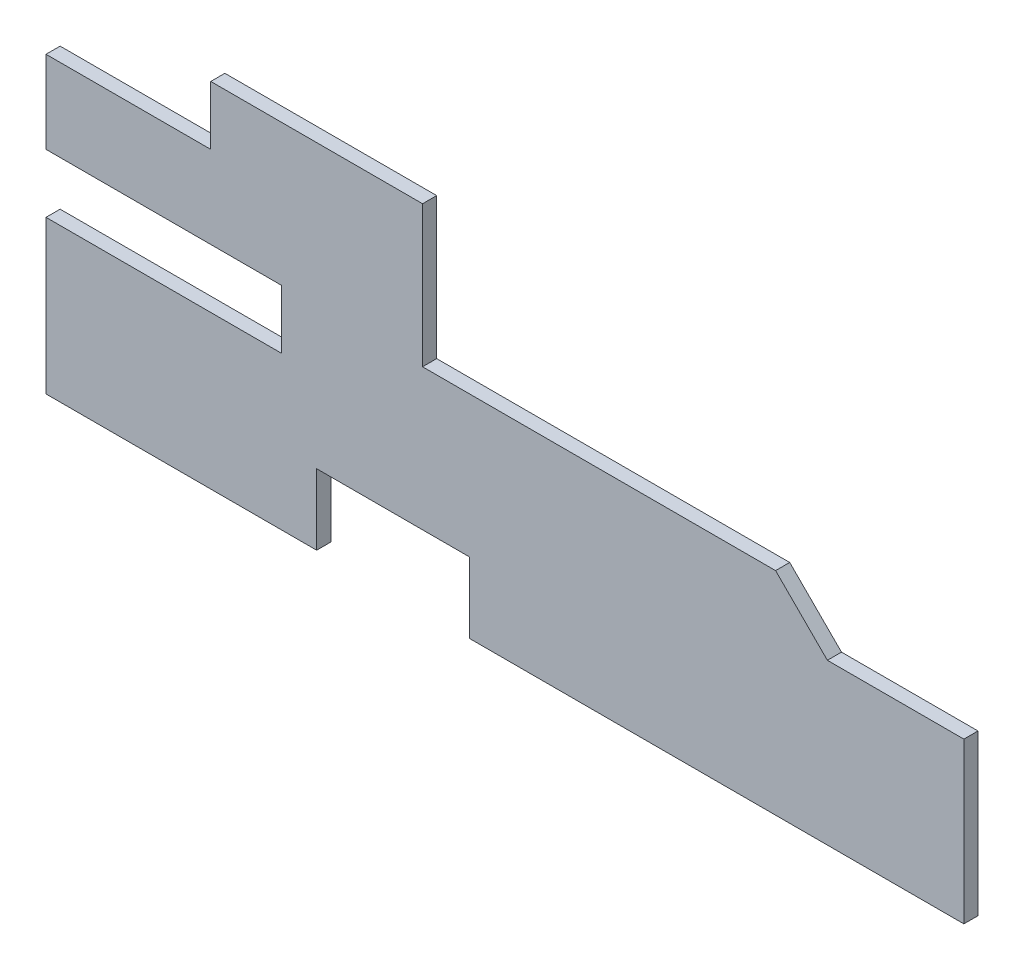
ISO-10303-21;
HEADER;
FILE_DESCRIPTION(('STEP AP214'),'2;1');
FILE_NAME('part.step','',(''),(''),'','','');
FILE_SCHEMA(('AUTOMOTIVE_DESIGN { 1 0 10303 214 1 1 1 1 }'));
ENDSEC;
DATA;
#1=APPLICATION_CONTEXT('core data for automotive mechanical design processes');
#2=APPLICATION_PROTOCOL_DEFINITION('international standard','automotive_design',2000,#1);
#3=PRODUCT_CONTEXT('',#1,'mechanical');
#4=PRODUCT('Part','Part','',(#3));
#5=PRODUCT_RELATED_PRODUCT_CATEGORY('part','',(#4));
#6=PRODUCT_DEFINITION_FORMATION('','',#4);
#7=PRODUCT_DEFINITION_CONTEXT('part definition',#1,'design');
#8=PRODUCT_DEFINITION('design','',#6,#7);
#9=PRODUCT_DEFINITION_SHAPE('','',#8);
#10=(LENGTH_UNIT() NAMED_UNIT(*) SI_UNIT(.MILLI.,.METRE.));
#11=(NAMED_UNIT(*) PLANE_ANGLE_UNIT() SI_UNIT($,.RADIAN.));
#12=(NAMED_UNIT(*) SI_UNIT($,.STERADIAN.) SOLID_ANGLE_UNIT());
#13=UNCERTAINTY_MEASURE_WITH_UNIT(LENGTH_MEASURE(1.E-05),#10,'distance_accuracy_value','');
#14=(GEOMETRIC_REPRESENTATION_CONTEXT(3) GLOBAL_UNCERTAINTY_ASSIGNED_CONTEXT((#13)) GLOBAL_UNIT_ASSIGNED_CONTEXT((#10,
#11,#12)) REPRESENTATION_CONTEXT('',''));
#15=CARTESIAN_POINT('',(0.,0.,0.));
#16=DIRECTION('',(0.,0.,1.));
#17=DIRECTION('',(1.,0.,0.));
#18=AXIS2_PLACEMENT_3D('',#15,#16,#17);
#19=CARTESIAN_POINT('',(0.,6.5,0.6));
#20=DIRECTION('',(1.,0.,0.));
#21=DIRECTION('',(0.,1.,0.));
#22=AXIS2_PLACEMENT_3D('',#19,#20,#21);
#23=PLANE('',#22);
#24=DIRECTION('',(0.,-1.,0.));
#25=VECTOR('',#24,1.);
#26=CARTESIAN_POINT('',(0.,6.5,0.));
#27=LINE('',#26,#25);
#28=CARTESIAN_POINT('',(0.,6.5,0.));
#29=VERTEX_POINT('',#28);
#30=CARTESIAN_POINT('',(0.,0.,0.));
#31=VERTEX_POINT('',#30);
#32=EDGE_CURVE('E190',#29,#31,#27,.T.);
#33=ORIENTED_EDGE('',*,*,#32,.T.);
#34=DIRECTION('',(0.,0.,-1.));
#35=VECTOR('',#34,1.);
#36=CARTESIAN_POINT('',(0.,0.,0.6));
#37=LINE('',#36,#35);
#38=CARTESIAN_POINT('',(0.,0.,0.6));
#39=VERTEX_POINT('',#38);
#40=EDGE_CURVE('E11',#39,#31,#37,.T.);
#41=ORIENTED_EDGE('',*,*,#40,.F.);
#42=DIRECTION('',(0.,-1.,0.));
#43=VECTOR('',#42,1.);
#44=CARTESIAN_POINT('',(0.,6.5,0.6));
#45=LINE('',#44,#43);
#46=CARTESIAN_POINT('',(0.,6.5,0.6));
#47=VERTEX_POINT('',#46);
#48=EDGE_CURVE('E224',#47,#39,#45,.T.);
#49=ORIENTED_EDGE('',*,*,#48,.F.);
#50=DIRECTION('',(0.,0.,-1.));
#51=VECTOR('',#50,1.);
#52=CARTESIAN_POINT('',(0.,6.5,0.6));
#53=LINE('',#52,#51);
#54=EDGE_CURVE('E186',#47,#29,#53,.T.);
#55=ORIENTED_EDGE('',*,*,#54,.T.);
#56=EDGE_LOOP('',(#33,#41,#49,#55));
#57=FACE_BOUND('',#56,.T.);
#58=ADVANCED_FACE('F34',(#57),#23,.F.);
#59=CARTESIAN_POINT('',(0.,0.,0.6));
#60=DIRECTION('',(0.,1.,0.));
#61=DIRECTION('',(0.,0.,1.));
#62=AXIS2_PLACEMENT_3D('',#59,#60,#61);
#63=PLANE('',#62);
#64=DIRECTION('',(1.,0.,0.));
#65=VECTOR('',#64,1.);
#66=CARTESIAN_POINT('',(0.,0.,0.));
#67=LINE('',#66,#65);
#68=CARTESIAN_POINT('',(11.5,0.,0.));
#69=VERTEX_POINT('',#68);
#70=EDGE_CURVE('E193',#31,#69,#67,.T.);
#71=ORIENTED_EDGE('',*,*,#70,.T.);
#72=DIRECTION('',(0.,0.,-1.));
#73=VECTOR('',#72,1.);
#74=CARTESIAN_POINT('',(11.5,0.,0.6));
#75=LINE('',#74,#73);
#76=CARTESIAN_POINT('',(11.5,0.,0.6));
#77=VERTEX_POINT('',#76);
#78=EDGE_CURVE('E42',#77,#69,#75,.T.);
#79=ORIENTED_EDGE('',*,*,#78,.F.);
#80=DIRECTION('',(1.,0.,0.));
#81=VECTOR('',#80,1.);
#82=CARTESIAN_POINT('',(0.,0.,0.6));
#83=LINE('',#82,#81);
#84=EDGE_CURVE('E123',#39,#77,#83,.T.);
#85=ORIENTED_EDGE('',*,*,#84,.F.);
#86=ORIENTED_EDGE('',*,*,#40,.T.);
#87=EDGE_LOOP('',(#71,#79,#85,#86));
#88=FACE_BOUND('',#87,.T.);
#89=ADVANCED_FACE('F332',(#88),#63,.F.);
#90=CARTESIAN_POINT('',(11.5,0.,0.6));
#91=DIRECTION('',(-1.,0.,0.));
#92=DIRECTION('',(0.,0.,1.));
#93=AXIS2_PLACEMENT_3D('',#90,#91,#92);
#94=PLANE('',#93);
#95=DIRECTION('',(0.,1.,0.));
#96=VECTOR('',#95,1.);
#97=CARTESIAN_POINT('',(11.5,0.,0.));
#98=LINE('',#97,#96);
#99=CARTESIAN_POINT('',(11.5,3.,0.));
#100=VERTEX_POINT('',#99);
#101=EDGE_CURVE('E195',#69,#100,#98,.T.);
#102=ORIENTED_EDGE('',*,*,#101,.T.);
#103=DIRECTION('',(0.,0.,-1.));
#104=VECTOR('',#103,1.);
#105=CARTESIAN_POINT('',(11.5,3.,0.6));
#106=LINE('',#105,#104);
#107=CARTESIAN_POINT('',(11.5,3.,0.6));
#108=VERTEX_POINT('',#107);
#109=EDGE_CURVE('E261',#108,#100,#106,.T.);
#110=ORIENTED_EDGE('',*,*,#109,.F.);
#111=DIRECTION('',(0.,1.,0.));
#112=VECTOR('',#111,1.);
#113=CARTESIAN_POINT('',(11.5,0.,0.6));
#114=LINE('',#113,#112);
#115=EDGE_CURVE('E269',#77,#108,#114,.T.);
#116=ORIENTED_EDGE('',*,*,#115,.F.);
#117=ORIENTED_EDGE('',*,*,#78,.T.);
#118=EDGE_LOOP('',(#102,#110,#116,#117));
#119=FACE_BOUND('',#118,.T.);
#120=ADVANCED_FACE('F267',(#119),#94,.F.);
#121=CARTESIAN_POINT('',(11.5,3.,0.6));
#122=DIRECTION('',(0.,1.,0.));
#123=DIRECTION('',(0.,0.,1.));
#124=AXIS2_PLACEMENT_3D('',#121,#122,#123);
#125=PLANE('',#124);
#126=DIRECTION('',(1.,0.,0.));
#127=VECTOR('',#126,1.);
#128=CARTESIAN_POINT('',(11.5,3.,0.));
#129=LINE('',#128,#127);
#130=CARTESIAN_POINT('',(18.,3.,0.));
#131=VERTEX_POINT('',#130);
#132=EDGE_CURVE('E197',#100,#131,#129,.T.);
#133=ORIENTED_EDGE('',*,*,#132,.T.);
#134=DIRECTION('',(0.,0.,-1.));
#135=VECTOR('',#134,1.);
#136=CARTESIAN_POINT('',(18.,3.,0.6));
#137=LINE('',#136,#135);
#138=CARTESIAN_POINT('',(18.,3.,0.6));
#139=VERTEX_POINT('',#138);
#140=EDGE_CURVE('E258',#139,#131,#137,.T.);
#141=ORIENTED_EDGE('',*,*,#140,.F.);
#142=DIRECTION('',(1.,0.,0.));
#143=VECTOR('',#142,1.);
#144=CARTESIAN_POINT('',(11.5,3.,0.6));
#145=LINE('',#144,#143);
#146=EDGE_CURVE('E287',#108,#139,#145,.T.);
#147=ORIENTED_EDGE('',*,*,#146,.F.);
#148=ORIENTED_EDGE('',*,*,#109,.T.);
#149=EDGE_LOOP('',(#133,#141,#147,#148));
#150=FACE_BOUND('',#149,.T.);
#151=ADVANCED_FACE('F278',(#150),#125,.F.);
#152=CARTESIAN_POINT('',(18.,3.,0.6));
#153=DIRECTION('',(1.,0.,0.));
#154=DIRECTION('',(0.,0.,-1.));
#155=AXIS2_PLACEMENT_3D('',#152,#153,#154);
#156=PLANE('',#155);
#157=DIRECTION('',(0.,-1.,0.));
#158=VECTOR('',#157,1.);
#159=CARTESIAN_POINT('',(18.,3.,0.));
#160=LINE('',#159,#158);
#161=CARTESIAN_POINT('',(18.,0.,0.));
#162=VERTEX_POINT('',#161);
#163=EDGE_CURVE('E199',#131,#162,#160,.T.);
#164=ORIENTED_EDGE('',*,*,#163,.T.);
#165=DIRECTION('',(0.,0.,-1.));
#166=VECTOR('',#165,1.);
#167=CARTESIAN_POINT('',(18.,0.,0.6));
#168=LINE('',#167,#166);
#169=CARTESIAN_POINT('',(18.,0.,0.6));
#170=VERTEX_POINT('',#169);
#171=EDGE_CURVE('E255',#170,#162,#168,.T.);
#172=ORIENTED_EDGE('',*,*,#171,.F.);
#173=DIRECTION('',(0.,-1.,0.));
#174=VECTOR('',#173,1.);
#175=CARTESIAN_POINT('',(18.,3.,0.6));
#176=LINE('',#175,#174);
#177=EDGE_CURVE('E284',#139,#170,#176,.T.);
#178=ORIENTED_EDGE('',*,*,#177,.F.);
#179=ORIENTED_EDGE('',*,*,#140,.T.);
#180=EDGE_LOOP('',(#164,#172,#178,#179));
#181=FACE_BOUND('',#180,.T.);
#182=ADVANCED_FACE('F282',(#181),#156,.F.);
#183=CARTESIAN_POINT('',(18.,0.,0.6));
#184=DIRECTION('',(0.,1.,0.));
#185=DIRECTION('',(0.,0.,1.));
#186=AXIS2_PLACEMENT_3D('',#183,#184,#185);
#187=PLANE('',#186);
#188=DIRECTION('',(1.,0.,0.));
#189=VECTOR('',#188,1.);
#190=CARTESIAN_POINT('',(18.,0.,0.));
#191=LINE('',#190,#189);
#192=CARTESIAN_POINT('',(39.,0.,0.));
#193=VERTEX_POINT('',#192);
#194=EDGE_CURVE('E201',#162,#193,#191,.T.);
#195=ORIENTED_EDGE('',*,*,#194,.T.);
#196=DIRECTION('',(0.,0.,-1.));
#197=VECTOR('',#196,1.);
#198=CARTESIAN_POINT('',(39.,0.,0.6));
#199=LINE('',#198,#197);
#200=CARTESIAN_POINT('',(39.,0.,0.6));
#201=VERTEX_POINT('',#200);
#202=EDGE_CURVE('E252',#201,#193,#199,.T.);
#203=ORIENTED_EDGE('',*,*,#202,.F.);
#204=DIRECTION('',(1.,0.,0.));
#205=VECTOR('',#204,1.);
#206=CARTESIAN_POINT('',(18.,0.,0.6));
#207=LINE('',#206,#205);
#208=EDGE_CURVE('E286',#170,#201,#207,.T.);
#209=ORIENTED_EDGE('',*,*,#208,.F.);
#210=ORIENTED_EDGE('',*,*,#171,.T.);
#211=EDGE_LOOP('',(#195,#203,#209,#210));
#212=FACE_BOUND('',#211,.T.);
#213=ADVANCED_FACE('F345',(#212),#187,.F.);
#214=CARTESIAN_POINT('',(39.,0.,0.6));
#215=DIRECTION('',(-1.,0.,0.));
#216=DIRECTION('',(0.,-1.,0.));
#217=AXIS2_PLACEMENT_3D('',#214,#215,#216);
#218=PLANE('',#217);
#219=DIRECTION('',(0.,1.,0.));
#220=VECTOR('',#219,1.);
#221=CARTESIAN_POINT('',(39.,0.,0.));
#222=LINE('',#221,#220);
#223=CARTESIAN_POINT('',(39.,6.8,0.));
#224=VERTEX_POINT('',#223);
#225=EDGE_CURVE('E203',#193,#224,#222,.T.);
#226=ORIENTED_EDGE('',*,*,#225,.T.);
#227=DIRECTION('',(0.,0.,-1.));
#228=VECTOR('',#227,1.);
#229=CARTESIAN_POINT('',(39.,6.8,0.6));
#230=LINE('',#229,#228);
#231=CARTESIAN_POINT('',(39.,6.8,0.6));
#232=VERTEX_POINT('',#231);
#233=EDGE_CURVE('E249',#232,#224,#230,.T.);
#234=ORIENTED_EDGE('',*,*,#233,.F.);
#235=DIRECTION('',(0.,1.,0.));
#236=VECTOR('',#235,1.);
#237=CARTESIAN_POINT('',(39.,0.,0.6));
#238=LINE('',#237,#236);
#239=EDGE_CURVE('E289',#201,#232,#238,.T.);
#240=ORIENTED_EDGE('',*,*,#239,.F.);
#241=ORIENTED_EDGE('',*,*,#202,.T.);
#242=EDGE_LOOP('',(#226,#234,#240,#241));
#243=FACE_BOUND('',#242,.T.);
#244=ADVANCED_FACE('F348',(#243),#218,.F.);
#245=CARTESIAN_POINT('',(39.,6.8,0.6));
#246=DIRECTION('',(0.,-1.,0.));
#247=DIRECTION('',(1.,0.,0.));
#248=AXIS2_PLACEMENT_3D('',#245,#246,#247);
#249=PLANE('',#248);
#250=DIRECTION('',(-1.,0.,0.));
#251=VECTOR('',#250,1.);
#252=CARTESIAN_POINT('',(39.,6.8,0.));
#253=LINE('',#252,#251);
#254=CARTESIAN_POINT('',(33.2,6.8,0.));
#255=VERTEX_POINT('',#254);
#256=EDGE_CURVE('E205',#224,#255,#253,.T.);
#257=ORIENTED_EDGE('',*,*,#256,.T.);
#258=DIRECTION('',(0.,0.,-1.));
#259=VECTOR('',#258,1.);
#260=CARTESIAN_POINT('',(33.2,6.8,0.6));
#261=LINE('',#260,#259);
#262=CARTESIAN_POINT('',(33.2,6.8,0.6));
#263=VERTEX_POINT('',#262);
#264=EDGE_CURVE('E246',#263,#255,#261,.T.);
#265=ORIENTED_EDGE('',*,*,#264,.F.);
#266=DIRECTION('',(-1.,0.,0.));
#267=VECTOR('',#266,1.);
#268=CARTESIAN_POINT('',(39.,6.8,0.6));
#269=LINE('',#268,#267);
#270=EDGE_CURVE('E295',#232,#263,#269,.T.);
#271=ORIENTED_EDGE('',*,*,#270,.F.);
#272=ORIENTED_EDGE('',*,*,#233,.T.);
#273=EDGE_LOOP('',(#257,#265,#271,#272));
#274=FACE_BOUND('',#273,.T.);
#275=ADVANCED_FACE('F352',(#274),#249,.F.);
#276=CARTESIAN_POINT('',(33.2,6.8,0.6));
#277=DIRECTION('',(-0.707106781186547,-0.707106781186548,0.));
#278=DIRECTION('',(0.707106781186548,-0.707106781186547,0.));
#279=AXIS2_PLACEMENT_3D('',#276,#277,#278);
#280=PLANE('',#279);
#281=DIRECTION('',(-0.707106781186548,0.707106781186547,0.));
#282=VECTOR('',#281,1.);
#283=CARTESIAN_POINT('',(33.2,6.8,0.));
#284=LINE('',#283,#282);
#285=CARTESIAN_POINT('',(31.,9.,0.));
#286=VERTEX_POINT('',#285);
#287=EDGE_CURVE('E207',#255,#286,#284,.T.);
#288=ORIENTED_EDGE('',*,*,#287,.T.);
#289=DIRECTION('',(0.,0.,-1.));
#290=VECTOR('',#289,1.);
#291=CARTESIAN_POINT('',(31.,9.,0.6));
#292=LINE('',#291,#290);
#293=CARTESIAN_POINT('',(31.,9.,0.6));
#294=VERTEX_POINT('',#293);
#295=EDGE_CURVE('E243',#294,#286,#292,.T.);
#296=ORIENTED_EDGE('',*,*,#295,.F.);
#297=DIRECTION('',(-0.707106781186548,0.707106781186547,0.));
#298=VECTOR('',#297,1.);
#299=CARTESIAN_POINT('',(33.2,6.8,0.6));
#300=LINE('',#299,#298);
#301=EDGE_CURVE('E297',#263,#294,#300,.T.);
#302=ORIENTED_EDGE('',*,*,#301,.F.);
#303=ORIENTED_EDGE('',*,*,#264,.T.);
#304=EDGE_LOOP('',(#288,#296,#302,#303));
#305=FACE_BOUND('',#304,.T.);
#306=ADVANCED_FACE('F356',(#305),#280,.F.);
#307=CARTESIAN_POINT('',(31.,9.,0.6));
#308=DIRECTION('',(0.,-1.,0.));
#309=DIRECTION('',(1.,0.,0.));
#310=AXIS2_PLACEMENT_3D('',#307,#308,#309);
#311=PLANE('',#310);
#312=DIRECTION('',(-1.,0.,0.));
#313=VECTOR('',#312,1.);
#314=CARTESIAN_POINT('',(31.,9.,0.));
#315=LINE('',#314,#313);
#316=CARTESIAN_POINT('',(16.,8.99999999999999,0.));
#317=VERTEX_POINT('',#316);
#318=EDGE_CURVE('E209',#286,#317,#315,.T.);
#319=ORIENTED_EDGE('',*,*,#318,.T.);
#320=DIRECTION('',(0.,0.,-1.));
#321=VECTOR('',#320,1.);
#322=CARTESIAN_POINT('',(16.,8.99999999999999,0.6));
#323=LINE('',#322,#321);
#324=CARTESIAN_POINT('',(16.,8.99999999999999,0.6));
#325=VERTEX_POINT('',#324);
#326=EDGE_CURVE('E240',#325,#317,#323,.T.);
#327=ORIENTED_EDGE('',*,*,#326,.F.);
#328=DIRECTION('',(-1.,0.,0.));
#329=VECTOR('',#328,1.);
#330=CARTESIAN_POINT('',(31.,9.,0.6));
#331=LINE('',#330,#329);
#332=EDGE_CURVE('E299',#294,#325,#331,.T.);
#333=ORIENTED_EDGE('',*,*,#332,.F.);
#334=ORIENTED_EDGE('',*,*,#295,.T.);
#335=EDGE_LOOP('',(#319,#327,#333,#334));
#336=FACE_BOUND('',#335,.T.);
#337=ADVANCED_FACE('F360',(#336),#311,.F.);
#338=CARTESIAN_POINT('',(16.,8.99999999999999,0.6));
#339=DIRECTION('',(-1.,0.,0.));
#340=DIRECTION('',(0.,0.,1.));
#341=AXIS2_PLACEMENT_3D('',#338,#339,#340);
#342=PLANE('',#341);
#343=DIRECTION('',(0.,1.,0.));
#344=VECTOR('',#343,1.);
#345=CARTESIAN_POINT('',(16.,8.99999999999999,0.));
#346=LINE('',#345,#344);
#347=CARTESIAN_POINT('',(16.,15.,0.));
#348=VERTEX_POINT('',#347);
#349=EDGE_CURVE('E211',#317,#348,#346,.T.);
#350=ORIENTED_EDGE('',*,*,#349,.T.);
#351=DIRECTION('',(0.,0.,-1.));
#352=VECTOR('',#351,1.);
#353=CARTESIAN_POINT('',(16.,15.,0.6));
#354=LINE('',#353,#352);
#355=CARTESIAN_POINT('',(16.,15.,0.6));
#356=VERTEX_POINT('',#355);
#357=EDGE_CURVE('E237',#356,#348,#354,.T.);
#358=ORIENTED_EDGE('',*,*,#357,.F.);
#359=DIRECTION('',(0.,1.,0.));
#360=VECTOR('',#359,1.);
#361=CARTESIAN_POINT('',(16.,8.99999999999999,0.6));
#362=LINE('',#361,#360);
#363=EDGE_CURVE('E301',#325,#356,#362,.T.);
#364=ORIENTED_EDGE('',*,*,#363,.F.);
#365=ORIENTED_EDGE('',*,*,#326,.T.);
#366=EDGE_LOOP('',(#350,#358,#364,#365));
#367=FACE_BOUND('',#366,.T.);
#368=ADVANCED_FACE('F364',(#367),#342,.F.);
#369=CARTESIAN_POINT('',(16.,15.,0.6));
#370=DIRECTION('',(0.,-1.,0.));
#371=DIRECTION('',(1.,0.,0.));
#372=AXIS2_PLACEMENT_3D('',#369,#370,#371);
#373=PLANE('',#372);
#374=DIRECTION('',(-1.,0.,0.));
#375=VECTOR('',#374,1.);
#376=CARTESIAN_POINT('',(16.,15.,0.));
#377=LINE('',#376,#375);
#378=CARTESIAN_POINT('',(7.,15.,0.));
#379=VERTEX_POINT('',#378);
#380=EDGE_CURVE('E213',#348,#379,#377,.T.);
#381=ORIENTED_EDGE('',*,*,#380,.T.);
#382=DIRECTION('',(0.,0.,-1.));
#383=VECTOR('',#382,1.);
#384=CARTESIAN_POINT('',(7.,15.,0.6));
#385=LINE('',#384,#383);
#386=CARTESIAN_POINT('',(7.,15.,0.6));
#387=VERTEX_POINT('',#386);
#388=EDGE_CURVE('E234',#387,#379,#385,.T.);
#389=ORIENTED_EDGE('',*,*,#388,.F.);
#390=DIRECTION('',(-1.,0.,0.));
#391=VECTOR('',#390,1.);
#392=CARTESIAN_POINT('',(16.,15.,0.6));
#393=LINE('',#392,#391);
#394=EDGE_CURVE('E303',#356,#387,#393,.T.);
#395=ORIENTED_EDGE('',*,*,#394,.F.);
#396=ORIENTED_EDGE('',*,*,#357,.T.);
#397=EDGE_LOOP('',(#381,#389,#395,#396));
#398=FACE_BOUND('',#397,.T.);
#399=ADVANCED_FACE('F368',(#398),#373,.F.);
#400=CARTESIAN_POINT('',(7.,15.,0.6));
#401=DIRECTION('',(1.,0.,0.));
#402=DIRECTION('',(0.,0.,-1.));
#403=AXIS2_PLACEMENT_3D('',#400,#401,#402);
#404=PLANE('',#403);
#405=DIRECTION('',(0.,-1.,0.));
#406=VECTOR('',#405,1.);
#407=CARTESIAN_POINT('',(7.,15.,0.));
#408=LINE('',#407,#406);
#409=CARTESIAN_POINT('',(7.,12.5,0.));
#410=VERTEX_POINT('',#409);
#411=EDGE_CURVE('E215',#379,#410,#408,.T.);
#412=ORIENTED_EDGE('',*,*,#411,.T.);
#413=DIRECTION('',(0.,0.,-1.));
#414=VECTOR('',#413,1.);
#415=CARTESIAN_POINT('',(7.,12.5,0.6));
#416=LINE('',#415,#414);
#417=CARTESIAN_POINT('',(7.,12.5,0.6));
#418=VERTEX_POINT('',#417);
#419=EDGE_CURVE('E231',#418,#410,#416,.T.);
#420=ORIENTED_EDGE('',*,*,#419,.F.);
#421=DIRECTION('',(0.,-1.,0.));
#422=VECTOR('',#421,1.);
#423=CARTESIAN_POINT('',(7.,15.,0.6));
#424=LINE('',#423,#422);
#425=EDGE_CURVE('E305',#387,#418,#424,.T.);
#426=ORIENTED_EDGE('',*,*,#425,.F.);
#427=ORIENTED_EDGE('',*,*,#388,.T.);
#428=EDGE_LOOP('',(#412,#420,#426,#427));
#429=FACE_BOUND('',#428,.T.);
#430=ADVANCED_FACE('F372',(#429),#404,.F.);
#431=CARTESIAN_POINT('',(7.,12.5,0.6));
#432=DIRECTION('',(0.,-1.,0.));
#433=DIRECTION('',(1.,0.,0.));
#434=AXIS2_PLACEMENT_3D('',#431,#432,#433);
#435=PLANE('',#434);
#436=DIRECTION('',(-1.,0.,0.));
#437=VECTOR('',#436,1.);
#438=CARTESIAN_POINT('',(7.,12.5,0.));
#439=LINE('',#438,#437);
#440=CARTESIAN_POINT('',(0.,12.5,0.));
#441=VERTEX_POINT('',#440);
#442=EDGE_CURVE('E217',#410,#441,#439,.T.);
#443=ORIENTED_EDGE('',*,*,#442,.T.);
#444=DIRECTION('',(0.,0.,-1.));
#445=VECTOR('',#444,1.);
#446=CARTESIAN_POINT('',(0.,12.5,0.6));
#447=LINE('',#446,#445);
#448=CARTESIAN_POINT('',(0.,12.5,0.6));
#449=VERTEX_POINT('',#448);
#450=EDGE_CURVE('E228',#449,#441,#447,.T.);
#451=ORIENTED_EDGE('',*,*,#450,.F.);
#452=DIRECTION('',(-1.,0.,0.));
#453=VECTOR('',#452,1.);
#454=CARTESIAN_POINT('',(7.,12.5,0.6));
#455=LINE('',#454,#453);
#456=EDGE_CURVE('E307',#418,#449,#455,.T.);
#457=ORIENTED_EDGE('',*,*,#456,.F.);
#458=ORIENTED_EDGE('',*,*,#419,.T.);
#459=EDGE_LOOP('',(#443,#451,#457,#458));
#460=FACE_BOUND('',#459,.T.);
#461=ADVANCED_FACE('F313',(#460),#435,.F.);
#462=CARTESIAN_POINT('',(0.,12.5,0.6));
#463=DIRECTION('',(1.,0.,0.));
#464=DIRECTION('',(0.,1.,0.));
#465=AXIS2_PLACEMENT_3D('',#462,#463,#464);
#466=PLANE('',#465);
#467=DIRECTION('',(0.,-1.,0.));
#468=VECTOR('',#467,1.);
#469=CARTESIAN_POINT('',(0.,12.5,0.));
#470=LINE('',#469,#468);
#471=CARTESIAN_POINT('',(0.,9.,0.));
#472=VERTEX_POINT('',#471);
#473=EDGE_CURVE('E219',#441,#472,#470,.T.);
#474=ORIENTED_EDGE('',*,*,#473,.T.);
#475=DIRECTION('',(0.,0.,-1.));
#476=VECTOR('',#475,1.);
#477=CARTESIAN_POINT('',(0.,9.,0.6));
#478=LINE('',#477,#476);
#479=CARTESIAN_POINT('',(0.,9.,0.6));
#480=VERTEX_POINT('',#479);
#481=EDGE_CURVE('E181',#480,#472,#478,.T.);
#482=ORIENTED_EDGE('',*,*,#481,.F.);
#483=DIRECTION('',(0.,-1.,0.));
#484=VECTOR('',#483,1.);
#485=CARTESIAN_POINT('',(0.,12.5,0.6));
#486=LINE('',#485,#484);
#487=EDGE_CURVE('E172',#449,#480,#486,.T.);
#488=ORIENTED_EDGE('',*,*,#487,.F.);
#489=ORIENTED_EDGE('',*,*,#450,.T.);
#490=EDGE_LOOP('',(#474,#482,#488,#489));
#491=FACE_BOUND('',#490,.T.);
#492=ADVANCED_FACE('F317',(#491),#466,.F.);
#493=CARTESIAN_POINT('',(0.,9.,0.6));
#494=DIRECTION('',(0.,1.,0.));
#495=DIRECTION('',(0.,0.,1.));
#496=AXIS2_PLACEMENT_3D('',#493,#494,#495);
#497=PLANE('',#496);
#498=DIRECTION('',(1.,0.,0.));
#499=VECTOR('',#498,1.);
#500=CARTESIAN_POINT('',(0.,9.,0.));
#501=LINE('',#500,#499);
#502=CARTESIAN_POINT('',(10.,9.,0.));
#503=VERTEX_POINT('',#502);
#504=EDGE_CURVE('E180',#472,#503,#501,.T.);
#505=ORIENTED_EDGE('',*,*,#504,.T.);
#506=DIRECTION('',(0.,0.,-1.));
#507=VECTOR('',#506,1.);
#508=CARTESIAN_POINT('',(10.,9.,0.6));
#509=LINE('',#508,#507);
#510=CARTESIAN_POINT('',(10.,9.,0.6));
#511=VERTEX_POINT('',#510);
#512=EDGE_CURVE('E177',#511,#503,#509,.T.);
#513=ORIENTED_EDGE('',*,*,#512,.F.);
#514=DIRECTION('',(1.,0.,0.));
#515=VECTOR('',#514,1.);
#516=CARTESIAN_POINT('',(0.,9.,0.6));
#517=LINE('',#516,#515);
#518=EDGE_CURVE('E166',#480,#511,#517,.T.);
#519=ORIENTED_EDGE('',*,*,#518,.F.);
#520=ORIENTED_EDGE('',*,*,#481,.T.);
#521=EDGE_LOOP('',(#505,#513,#519,#520));
#522=FACE_BOUND('',#521,.T.);
#523=ADVANCED_FACE('F178',(#522),#497,.F.);
#524=CARTESIAN_POINT('',(10.,9.,0.6));
#525=DIRECTION('',(1.,0.,0.));
#526=DIRECTION('',(0.,0.,-1.));
#527=AXIS2_PLACEMENT_3D('',#524,#525,#526);
#528=PLANE('',#527);
#529=DIRECTION('',(0.,-1.,0.));
#530=VECTOR('',#529,1.);
#531=CARTESIAN_POINT('',(10.,9.,0.));
#532=LINE('',#531,#530);
#533=CARTESIAN_POINT('',(10.,6.5,0.));
#534=VERTEX_POINT('',#533);
#535=EDGE_CURVE('E109',#503,#534,#532,.T.);
#536=ORIENTED_EDGE('',*,*,#535,.T.);
#537=DIRECTION('',(0.,0.,-1.));
#538=VECTOR('',#537,1.);
#539=CARTESIAN_POINT('',(10.,6.5,0.6));
#540=LINE('',#539,#538);
#541=CARTESIAN_POINT('',(10.,6.5,0.6));
#542=VERTEX_POINT('',#541);
#543=EDGE_CURVE('E182',#542,#534,#540,.T.);
#544=ORIENTED_EDGE('',*,*,#543,.F.);
#545=DIRECTION('',(0.,-1.,0.));
#546=VECTOR('',#545,1.);
#547=CARTESIAN_POINT('',(10.,9.,0.6));
#548=LINE('',#547,#546);
#549=EDGE_CURVE('E170',#511,#542,#548,.T.);
#550=ORIENTED_EDGE('',*,*,#549,.F.);
#551=ORIENTED_EDGE('',*,*,#512,.T.);
#552=EDGE_LOOP('',(#536,#544,#550,#551));
#553=FACE_BOUND('',#552,.T.);
#554=ADVANCED_FACE('F184',(#553),#528,.F.);
#555=CARTESIAN_POINT('',(10.,6.5,0.6));
#556=DIRECTION('',(0.,-1.,0.));
#557=DIRECTION('',(1.,0.,0.));
#558=AXIS2_PLACEMENT_3D('',#555,#556,#557);
#559=PLANE('',#558);
#560=DIRECTION('',(-1.,0.,0.));
#561=VECTOR('',#560,1.);
#562=CARTESIAN_POINT('',(10.,6.5,0.));
#563=LINE('',#562,#561);
#564=EDGE_CURVE('E115',#534,#29,#563,.T.);
#565=ORIENTED_EDGE('',*,*,#564,.T.);
#566=ORIENTED_EDGE('',*,*,#54,.F.);
#567=DIRECTION('',(-1.,0.,0.));
#568=VECTOR('',#567,1.);
#569=CARTESIAN_POINT('',(10.,6.5,0.6));
#570=LINE('',#569,#568);
#571=EDGE_CURVE('E50',#542,#47,#570,.T.);
#572=ORIENTED_EDGE('',*,*,#571,.F.);
#573=ORIENTED_EDGE('',*,*,#543,.T.);
#574=EDGE_LOOP('',(#565,#566,#572,#573));
#575=FACE_BOUND('',#574,.T.);
#576=ADVANCED_FACE('F321',(#575),#559,.F.);
#577=CARTESIAN_POINT('',(0.,0.,0.6));
#578=DIRECTION('',(0.,0.,1.));
#579=DIRECTION('',(1.,0.,0.));
#580=AXIS2_PLACEMENT_3D('',#577,#578,#579);
#581=PLANE('',#580);
#582=ORIENTED_EDGE('',*,*,#48,.T.);
#583=ORIENTED_EDGE('',*,*,#84,.T.);
#584=ORIENTED_EDGE('',*,*,#115,.T.);
#585=ORIENTED_EDGE('',*,*,#146,.T.);
#586=ORIENTED_EDGE('',*,*,#177,.T.);
#587=ORIENTED_EDGE('',*,*,#208,.T.);
#588=ORIENTED_EDGE('',*,*,#239,.T.);
#589=ORIENTED_EDGE('',*,*,#270,.T.);
#590=ORIENTED_EDGE('',*,*,#301,.T.);
#591=ORIENTED_EDGE('',*,*,#332,.T.);
#592=ORIENTED_EDGE('',*,*,#363,.T.);
#593=ORIENTED_EDGE('',*,*,#394,.T.);
#594=ORIENTED_EDGE('',*,*,#425,.T.);
#595=ORIENTED_EDGE('',*,*,#456,.T.);
#596=ORIENTED_EDGE('',*,*,#487,.T.);
#597=ORIENTED_EDGE('',*,*,#518,.T.);
#598=ORIENTED_EDGE('',*,*,#549,.T.);
#599=ORIENTED_EDGE('',*,*,#571,.T.);
#600=EDGE_LOOP('',(#582,#583,#584,#585,#586,#587,#588,#589,#590,#591,#592,#593,#594,#595,#596,
#597,#598,#599));
#601=FACE_BOUND('',#600,.T.);
#602=ADVANCED_FACE('F168',(#601),#581,.T.);
#603=CARTESIAN_POINT('',(0.,0.,0.));
#604=DIRECTION('',(0.,0.,1.));
#605=DIRECTION('',(1.,0.,0.));
#606=AXIS2_PLACEMENT_3D('',#603,#604,#605);
#607=PLANE('',#606);
#608=ORIENTED_EDGE('',*,*,#32,.F.);
#609=ORIENTED_EDGE('',*,*,#564,.F.);
#610=ORIENTED_EDGE('',*,*,#535,.F.);
#611=ORIENTED_EDGE('',*,*,#504,.F.);
#612=ORIENTED_EDGE('',*,*,#473,.F.);
#613=ORIENTED_EDGE('',*,*,#442,.F.);
#614=ORIENTED_EDGE('',*,*,#411,.F.);
#615=ORIENTED_EDGE('',*,*,#380,.F.);
#616=ORIENTED_EDGE('',*,*,#349,.F.);
#617=ORIENTED_EDGE('',*,*,#318,.F.);
#618=ORIENTED_EDGE('',*,*,#287,.F.);
#619=ORIENTED_EDGE('',*,*,#256,.F.);
#620=ORIENTED_EDGE('',*,*,#225,.F.);
#621=ORIENTED_EDGE('',*,*,#194,.F.);
#622=ORIENTED_EDGE('',*,*,#163,.F.);
#623=ORIENTED_EDGE('',*,*,#132,.F.);
#624=ORIENTED_EDGE('',*,*,#101,.F.);
#625=ORIENTED_EDGE('',*,*,#70,.F.);
#626=EDGE_LOOP('',(#608,#609,#610,#611,#612,#613,#614,#615,#616,#617,#618,#619,#620,#621,#622,
#623,#624,#625));
#627=FACE_BOUND('',#626,.T.);
#628=ADVANCED_FACE('F273',(#627),#607,.F.);
#629=CLOSED_SHELL('',(#58,#89,#120,#151,#182,#213,#244,#275,#306,#337,#368,#399,#430,#461,#492,
#523,#554,#576,#602,#628));
#630=MANIFOLD_SOLID_BREP('B2',#629);
#631=ADVANCED_BREP_SHAPE_REPRESENTATION('',(#18,#630),#14);
#632=SHAPE_DEFINITION_REPRESENTATION(#9,#631);
ENDSEC;
END-ISO-10303-21;
